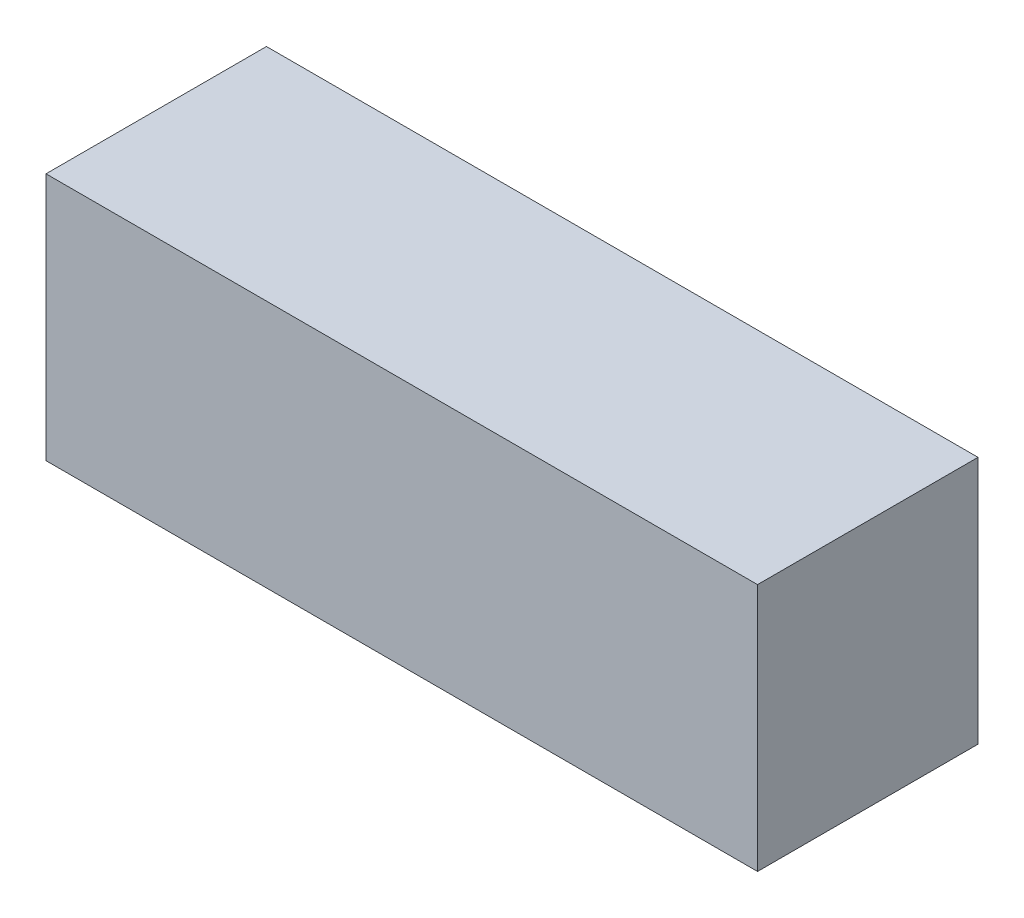
ISO-10303-21;
HEADER;
FILE_DESCRIPTION(('STEP AP214'),'2;1');
FILE_NAME('part.step','',(''),(''),'','','');
FILE_SCHEMA(('AUTOMOTIVE_DESIGN { 1 0 10303 214 1 1 1 1 }'));
ENDSEC;
DATA;
#1=APPLICATION_CONTEXT('core data for automotive mechanical design processes');
#2=APPLICATION_PROTOCOL_DEFINITION('international standard','automotive_design',2000,#1);
#3=PRODUCT_CONTEXT('',#1,'mechanical');
#4=PRODUCT('Part','Part','',(#3));
#5=PRODUCT_RELATED_PRODUCT_CATEGORY('part','',(#4));
#6=PRODUCT_DEFINITION_FORMATION('','',#4);
#7=PRODUCT_DEFINITION_CONTEXT('part definition',#1,'design');
#8=PRODUCT_DEFINITION('design','',#6,#7);
#9=PRODUCT_DEFINITION_SHAPE('','',#8);
#10=(LENGTH_UNIT() NAMED_UNIT(*) SI_UNIT(.MILLI.,.METRE.));
#11=(NAMED_UNIT(*) PLANE_ANGLE_UNIT() SI_UNIT($,.RADIAN.));
#12=(NAMED_UNIT(*) SI_UNIT($,.STERADIAN.) SOLID_ANGLE_UNIT());
#13=UNCERTAINTY_MEASURE_WITH_UNIT(LENGTH_MEASURE(1.E-05),#10,'distance_accuracy_value','');
#14=(GEOMETRIC_REPRESENTATION_CONTEXT(3) GLOBAL_UNCERTAINTY_ASSIGNED_CONTEXT((#13)) GLOBAL_UNIT_ASSIGNED_CONTEXT((#10,
#11,#12)) REPRESENTATION_CONTEXT('',''));
#15=CARTESIAN_POINT('',(0.,0.,0.));
#16=DIRECTION('',(0.,0.,1.));
#17=DIRECTION('',(1.,0.,0.));
#18=AXIS2_PLACEMENT_3D('',#15,#16,#17);
#19=CARTESIAN_POINT('',(0.,54.102,0.));
#20=DIRECTION('',(1.,0.,0.));
#21=DIRECTION('',(0.,0.,-1.));
#22=AXIS2_PLACEMENT_3D('',#19,#20,#21);
#23=PLANE('',#22);
#24=DIRECTION('',(0.,0.,1.));
#25=VECTOR('',#24,1.);
#26=CARTESIAN_POINT('',(0.,0.,0.));
#27=LINE('',#26,#25);
#28=CARTESIAN_POINT('',(0.,0.,-48.006));
#29=VERTEX_POINT('',#28);
#30=CARTESIAN_POINT('',(0.,0.,0.));
#31=VERTEX_POINT('',#30);
#32=EDGE_CURVE('E99',#29,#31,#27,.T.);
#33=ORIENTED_EDGE('',*,*,#32,.T.);
#34=DIRECTION('',(0.,-1.,0.));
#35=VECTOR('',#34,1.);
#36=CARTESIAN_POINT('',(0.,54.102,0.));
#37=LINE('',#36,#35);
#38=CARTESIAN_POINT('',(0.,54.102,0.));
#39=VERTEX_POINT('',#38);
#40=EDGE_CURVE('E11',#39,#31,#37,.T.);
#41=ORIENTED_EDGE('',*,*,#40,.F.);
#42=DIRECTION('',(0.,0.,1.));
#43=VECTOR('',#42,1.);
#44=CARTESIAN_POINT('',(0.,54.102,0.));
#45=LINE('',#44,#43);
#46=CARTESIAN_POINT('',(0.,54.102,-48.006));
#47=VERTEX_POINT('',#46);
#48=EDGE_CURVE('E87',#47,#39,#45,.T.);
#49=ORIENTED_EDGE('',*,*,#48,.F.);
#50=DIRECTION('',(0.,-1.,0.));
#51=VECTOR('',#50,1.);
#52=CARTESIAN_POINT('',(0.,54.102,-48.006));
#53=LINE('',#52,#51);
#54=EDGE_CURVE('E95',#47,#29,#53,.T.);
#55=ORIENTED_EDGE('',*,*,#54,.T.);
#56=EDGE_LOOP('',(#33,#41,#49,#55));
#57=FACE_BOUND('',#56,.T.);
#58=ADVANCED_FACE('F36',(#57),#23,.F.);
#59=CARTESIAN_POINT('',(0.,54.102,0.));
#60=DIRECTION('',(0.,0.,-1.));
#61=DIRECTION('',(-1.,0.,0.));
#62=AXIS2_PLACEMENT_3D('',#59,#60,#61);
#63=PLANE('',#62);
#64=DIRECTION('',(1.,0.,0.));
#65=VECTOR('',#64,1.);
#66=CARTESIAN_POINT('',(0.,0.,0.));
#67=LINE('',#66,#65);
#68=CARTESIAN_POINT('',(154.94,0.,0.));
#69=VERTEX_POINT('',#68);
#70=EDGE_CURVE('E91',#31,#69,#67,.T.);
#71=ORIENTED_EDGE('',*,*,#70,.T.);
#72=DIRECTION('',(0.,-1.,0.));
#73=VECTOR('',#72,1.);
#74=CARTESIAN_POINT('',(154.94,54.102,0.));
#75=LINE('',#74,#73);
#76=CARTESIAN_POINT('',(154.94,54.102,0.));
#77=VERTEX_POINT('',#76);
#78=EDGE_CURVE('E44',#77,#69,#75,.T.);
#79=ORIENTED_EDGE('',*,*,#78,.F.);
#80=DIRECTION('',(1.,0.,0.));
#81=VECTOR('',#80,1.);
#82=CARTESIAN_POINT('',(0.,54.102,0.));
#83=LINE('',#82,#81);
#84=EDGE_CURVE('E82',#39,#77,#83,.T.);
#85=ORIENTED_EDGE('',*,*,#84,.F.);
#86=ORIENTED_EDGE('',*,*,#40,.T.);
#87=EDGE_LOOP('',(#71,#79,#85,#86));
#88=FACE_BOUND('',#87,.T.);
#89=ADVANCED_FACE('F90',(#88),#63,.F.);
#90=CARTESIAN_POINT('',(154.94,54.102,0.));
#91=DIRECTION('',(-1.,0.,0.));
#92=DIRECTION('',(0.,0.,1.));
#93=AXIS2_PLACEMENT_3D('',#90,#91,#92);
#94=PLANE('',#93);
#95=DIRECTION('',(0.,0.,-1.));
#96=VECTOR('',#95,1.);
#97=CARTESIAN_POINT('',(154.94,0.,0.));
#98=LINE('',#97,#96);
#99=CARTESIAN_POINT('',(154.94,0.,-48.006));
#100=VERTEX_POINT('',#99);
#101=EDGE_CURVE('E69',#69,#100,#98,.T.);
#102=ORIENTED_EDGE('',*,*,#101,.T.);
#103=DIRECTION('',(0.,-1.,0.));
#104=VECTOR('',#103,1.);
#105=CARTESIAN_POINT('',(154.94,54.102,-48.006));
#106=LINE('',#105,#104);
#107=CARTESIAN_POINT('',(154.94,54.102,-48.006));
#108=VERTEX_POINT('',#107);
#109=EDGE_CURVE('E92',#108,#100,#106,.T.);
#110=ORIENTED_EDGE('',*,*,#109,.F.);
#111=DIRECTION('',(0.,0.,-1.));
#112=VECTOR('',#111,1.);
#113=CARTESIAN_POINT('',(154.94,54.102,0.));
#114=LINE('',#113,#112);
#115=EDGE_CURVE('E85',#77,#108,#114,.T.);
#116=ORIENTED_EDGE('',*,*,#115,.F.);
#117=ORIENTED_EDGE('',*,*,#78,.T.);
#118=EDGE_LOOP('',(#102,#110,#116,#117));
#119=FACE_BOUND('',#118,.T.);
#120=ADVANCED_FACE('F93',(#119),#94,.F.);
#121=CARTESIAN_POINT('',(0.,54.102,-48.006));
#122=DIRECTION('',(0.,0.,1.));
#123=DIRECTION('',(1.,0.,0.));
#124=AXIS2_PLACEMENT_3D('',#121,#122,#123);
#125=PLANE('',#124);
#126=DIRECTION('',(-1.,0.,0.));
#127=VECTOR('',#126,1.);
#128=CARTESIAN_POINT('',(0.,0.,-48.006));
#129=LINE('',#128,#127);
#130=EDGE_CURVE('E75',#100,#29,#129,.T.);
#131=ORIENTED_EDGE('',*,*,#130,.T.);
#132=ORIENTED_EDGE('',*,*,#54,.F.);
#133=DIRECTION('',(-1.,0.,0.));
#134=VECTOR('',#133,1.);
#135=CARTESIAN_POINT('',(0.,54.102,-48.006));
#136=LINE('',#135,#134);
#137=EDGE_CURVE('E52',#108,#47,#136,.T.);
#138=ORIENTED_EDGE('',*,*,#137,.F.);
#139=ORIENTED_EDGE('',*,*,#109,.T.);
#140=EDGE_LOOP('',(#131,#132,#138,#139));
#141=FACE_BOUND('',#140,.T.);
#142=ADVANCED_FACE('F106',(#141),#125,.F.);
#143=CARTESIAN_POINT('',(0.,54.102,0.));
#144=DIRECTION('',(0.,-1.,0.));
#145=DIRECTION('',(0.,0.,-1.));
#146=AXIS2_PLACEMENT_3D('',#143,#144,#145);
#147=PLANE('',#146);
#148=ORIENTED_EDGE('',*,*,#48,.T.);
#149=ORIENTED_EDGE('',*,*,#84,.T.);
#150=ORIENTED_EDGE('',*,*,#115,.T.);
#151=ORIENTED_EDGE('',*,*,#137,.T.);
#152=EDGE_LOOP('',(#148,#149,#150,#151));
#153=FACE_BOUND('',#152,.T.);
#154=ADVANCED_FACE('F83',(#153),#147,.F.);
#155=CARTESIAN_POINT('',(0.,0.,0.));
#156=DIRECTION('',(0.,-1.,0.));
#157=DIRECTION('',(0.,0.,-1.));
#158=AXIS2_PLACEMENT_3D('',#155,#156,#157);
#159=PLANE('',#158);
#160=ORIENTED_EDGE('',*,*,#32,.F.);
#161=ORIENTED_EDGE('',*,*,#130,.F.);
#162=ORIENTED_EDGE('',*,*,#101,.F.);
#163=ORIENTED_EDGE('',*,*,#70,.F.);
#164=EDGE_LOOP('',(#160,#161,#162,#163));
#165=FACE_BOUND('',#164,.T.);
#166=ADVANCED_FACE('F109',(#165),#159,.T.);
#167=CLOSED_SHELL('',(#58,#89,#120,#142,#154,#166));
#168=MANIFOLD_SOLID_BREP('B2',#167);
#169=ADVANCED_BREP_SHAPE_REPRESENTATION('',(#18,#168),#14);
#170=SHAPE_DEFINITION_REPRESENTATION(#9,#169);
ENDSEC;
END-ISO-10303-21;
